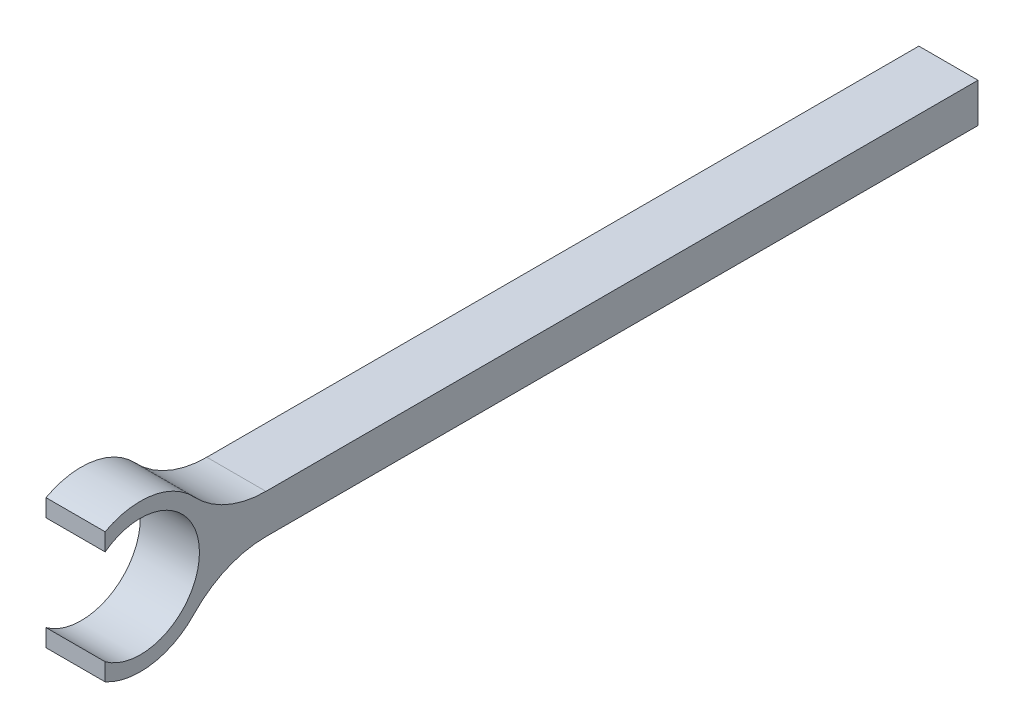
ISO-10303-21;
HEADER;
FILE_DESCRIPTION(('STEP AP214'),'2;1');
FILE_NAME('part.step','',(''),(''),'','','');
FILE_SCHEMA(('AUTOMOTIVE_DESIGN { 1 0 10303 214 1 1 1 1 }'));
ENDSEC;
DATA;
#1=APPLICATION_CONTEXT('core data for automotive mechanical design processes');
#2=APPLICATION_PROTOCOL_DEFINITION('international standard','automotive_design',2000,#1);
#3=PRODUCT_CONTEXT('',#1,'mechanical');
#4=PRODUCT('Part','Part','',(#3));
#5=PRODUCT_RELATED_PRODUCT_CATEGORY('part','',(#4));
#6=PRODUCT_DEFINITION_FORMATION('','',#4);
#7=PRODUCT_DEFINITION_CONTEXT('part definition',#1,'design');
#8=PRODUCT_DEFINITION('design','',#6,#7);
#9=PRODUCT_DEFINITION_SHAPE('','',#8);
#10=(LENGTH_UNIT() NAMED_UNIT(*) SI_UNIT(.MILLI.,.METRE.));
#11=(NAMED_UNIT(*) PLANE_ANGLE_UNIT() SI_UNIT($,.RADIAN.));
#12=(NAMED_UNIT(*) SI_UNIT($,.STERADIAN.) SOLID_ANGLE_UNIT());
#13=UNCERTAINTY_MEASURE_WITH_UNIT(LENGTH_MEASURE(1.E-05),#10,'distance_accuracy_value','');
#14=(GEOMETRIC_REPRESENTATION_CONTEXT(3) GLOBAL_UNCERTAINTY_ASSIGNED_CONTEXT((#13)) GLOBAL_UNIT_ASSIGNED_CONTEXT((#10,
#11,#12)) REPRESENTATION_CONTEXT('',''));
#15=CARTESIAN_POINT('',(0.,0.,0.));
#16=DIRECTION('',(0.,0.,1.));
#17=DIRECTION('',(1.,0.,0.));
#18=AXIS2_PLACEMENT_3D('',#15,#16,#17);
#19=CARTESIAN_POINT('',(6.,0.,0.));
#20=DIRECTION('',(-1.,0.,0.));
#21=DIRECTION('',(0.,0.,1.));
#22=AXIS2_PLACEMENT_3D('',#19,#20,#21);
#23=CYLINDRICAL_SURFACE('',#22,6.);
#24=CARTESIAN_POINT('',(0.,0.,0.));
#25=DIRECTION('',(1.,0.,0.));
#26=DIRECTION('',(0.,0.,-1.));
#27=AXIS2_PLACEMENT_3D('',#24,#25,#26);
#28=CIRCLE('',#27,6.);
#29=CARTESIAN_POINT('',(0.,-4.82343828467986,3.56853514959354));
#30=VERTEX_POINT('',#29);
#31=CARTESIAN_POINT('',(0.,4.82343828467986,3.56853514959354));
#32=VERTEX_POINT('',#31);
#33=EDGE_CURVE('E117',#30,#32,#28,.T.);
#34=ORIENTED_EDGE('',*,*,#33,.F.);
#35=DIRECTION('',(-1.,0.,0.));
#36=VECTOR('',#35,1.);
#37=CARTESIAN_POINT('',(6.,-4.82343828467986,3.56853514959354));
#38=LINE('',#37,#36);
#39=CARTESIAN_POINT('',(6.,-4.82343828467986,3.56853514959354));
#40=VERTEX_POINT('',#39);
#41=EDGE_CURVE('E112',#40,#30,#38,.T.);
#42=ORIENTED_EDGE('',*,*,#41,.F.);
#43=CARTESIAN_POINT('',(6.,0.,0.));
#44=DIRECTION('',(1.,0.,0.));
#45=DIRECTION('',(0.,0.,-1.));
#46=AXIS2_PLACEMENT_3D('',#43,#44,#45);
#47=CIRCLE('',#46,6.);
#48=CARTESIAN_POINT('',(6.,4.82343828467986,3.56853514959354));
#49=VERTEX_POINT('',#48);
#50=EDGE_CURVE('E115',#40,#49,#47,.T.);
#51=ORIENTED_EDGE('',*,*,#50,.T.);
#52=DIRECTION('',(-1.,0.,0.));
#53=VECTOR('',#52,1.);
#54=CARTESIAN_POINT('',(6.,4.82343828467986,3.56853514959354));
#55=LINE('',#54,#53);
#56=EDGE_CURVE('E160',#49,#32,#55,.T.);
#57=ORIENTED_EDGE('',*,*,#56,.T.);
#58=EDGE_LOOP('',(#34,#42,#51,#57));
#59=FACE_BOUND('',#58,.T.);
#60=ADVANCED_FACE('F35',(#59),#23,.F.);
#61=CARTESIAN_POINT('',(6.,0.,3.56853514959354));
#62=DIRECTION('',(0.,0.,-1.));
#63=DIRECTION('',(0.,1.,0.));
#64=AXIS2_PLACEMENT_3D('',#61,#62,#63);
#65=PLANE('',#64);
#66=DIRECTION('',(0.,-1.,0.));
#67=VECTOR('',#66,1.);
#68=CARTESIAN_POINT('',(0.,0.,3.56853514959354));
#69=LINE('',#68,#67);
#70=CARTESIAN_POINT('',(0.,-6.59663223820423,3.56853514959354));
#71=VERTEX_POINT('',#70);
#72=EDGE_CURVE('E139',#30,#71,#69,.T.);
#73=ORIENTED_EDGE('',*,*,#72,.T.);
#74=DIRECTION('',(-1.,0.,0.));
#75=VECTOR('',#74,1.);
#76=CARTESIAN_POINT('',(6.,-6.59663223820423,3.56853514959354));
#77=LINE('',#76,#75);
#78=CARTESIAN_POINT('',(6.,-6.59663223820423,3.56853514959354));
#79=VERTEX_POINT('',#78);
#80=EDGE_CURVE('E121',#79,#71,#77,.T.);
#81=ORIENTED_EDGE('',*,*,#80,.F.);
#82=DIRECTION('',(0.,-1.,0.));
#83=VECTOR('',#82,1.);
#84=CARTESIAN_POINT('',(6.,0.,3.56853514959354));
#85=LINE('',#84,#83);
#86=EDGE_CURVE('E124',#40,#79,#85,.T.);
#87=ORIENTED_EDGE('',*,*,#86,.F.);
#88=ORIENTED_EDGE('',*,*,#41,.T.);
#89=EDGE_LOOP('',(#73,#81,#87,#88));
#90=FACE_BOUND('',#89,.T.);
#91=ADVANCED_FACE('F125',(#90),#65,.F.);
#92=CARTESIAN_POINT('',(6.,0.,0.));
#93=DIRECTION('',(-1.,0.,0.));
#94=DIRECTION('',(0.,0.,1.));
#95=AXIS2_PLACEMENT_3D('',#92,#93,#94);
#96=CYLINDRICAL_SURFACE('',#95,7.5);
#97=CARTESIAN_POINT('',(0.,0.,0.));
#98=DIRECTION('',(1.,0.,0.));
#99=DIRECTION('',(0.,0.,-1.));
#100=AXIS2_PLACEMENT_3D('',#97,#98,#99);
#101=CIRCLE('',#100,7.5);
#102=CARTESIAN_POINT('',(0.,-5.13860338649339,-5.46303535008869));
#103=VERTEX_POINT('',#102);
#104=EDGE_CURVE('E151',#71,#103,#101,.T.);
#105=ORIENTED_EDGE('',*,*,#104,.T.);
#106=DIRECTION('',(-1.,0.,0.));
#107=VECTOR('',#106,1.);
#108=CARTESIAN_POINT('',(6.,-5.13860338649339,-5.46303535008869));
#109=LINE('',#108,#107);
#110=CARTESIAN_POINT('',(6.,-5.13860338649339,-5.46303535008869));
#111=VERTEX_POINT('',#110);
#112=EDGE_CURVE('E50',#103,#111,#109,.F.);
#113=ORIENTED_EDGE('',*,*,#112,.T.);
#114=CARTESIAN_POINT('',(6.,0.,0.));
#115=DIRECTION('',(1.,0.,0.));
#116=DIRECTION('',(0.,0.,-1.));
#117=AXIS2_PLACEMENT_3D('',#114,#115,#116);
#118=CIRCLE('',#117,7.5);
#119=EDGE_CURVE('E128',#79,#111,#118,.T.);
#120=ORIENTED_EDGE('',*,*,#119,.F.);
#121=ORIENTED_EDGE('',*,*,#80,.T.);
#122=EDGE_LOOP('',(#105,#113,#120,#121));
#123=FACE_BOUND('',#122,.T.);
#124=ADVANCED_FACE('F211',(#123),#96,.T.);
#125=CARTESIAN_POINT('',(6.,-1.99007456848459,0.));
#126=DIRECTION('',(0.,1.,0.));
#127=DIRECTION('',(0.,0.,1.));
#128=AXIS2_PLACEMENT_3D('',#125,#126,#127);
#129=PLANE('',#128);
#130=DIRECTION('',(0.,0.,-1.));
#131=VECTOR('',#130,1.);
#132=CARTESIAN_POINT('',(6.,-1.99007456848459,0.));
#133=LINE('',#132,#131);
#134=CARTESIAN_POINT('',(6.,-1.99007456848459,-12.7470824835403));
#135=VERTEX_POINT('',#134);
#136=CARTESIAN_POINT('',(6.,-1.99007456848459,-85.));
#137=VERTEX_POINT('',#136);
#138=EDGE_CURVE('E142',#135,#137,#133,.T.);
#139=ORIENTED_EDGE('',*,*,#138,.F.);
#140=DIRECTION('',(1.,0.,0.));
#141=VECTOR('',#140,1.);
#142=CARTESIAN_POINT('',(0.,-1.99007456848459,-12.7470824835403));
#143=LINE('',#142,#141);
#144=CARTESIAN_POINT('',(0.,-1.99007456848459,-12.7470824835403));
#145=VERTEX_POINT('',#144);
#146=EDGE_CURVE('E176',#135,#145,#143,.F.);
#147=ORIENTED_EDGE('',*,*,#146,.T.);
#148=DIRECTION('',(0.,0.,-1.));
#149=VECTOR('',#148,1.);
#150=CARTESIAN_POINT('',(0.,-1.99007456848459,0.));
#151=LINE('',#150,#149);
#152=CARTESIAN_POINT('',(0.,-1.99007456848459,-85.));
#153=VERTEX_POINT('',#152);
#154=EDGE_CURVE('E153',#145,#153,#151,.T.);
#155=ORIENTED_EDGE('',*,*,#154,.T.);
#156=DIRECTION('',(-1.,0.,0.));
#157=VECTOR('',#156,1.);
#158=CARTESIAN_POINT('',(6.,-1.99007456848459,-85.));
#159=LINE('',#158,#157);
#160=EDGE_CURVE('E168',#137,#153,#159,.T.);
#161=ORIENTED_EDGE('',*,*,#160,.F.);
#162=EDGE_LOOP('',(#139,#147,#155,#161));
#163=FACE_BOUND('',#162,.T.);
#164=ADVANCED_FACE('F207',(#163),#129,.F.);
#165=CARTESIAN_POINT('',(6.,0.,-85.));
#166=DIRECTION('',(0.,0.,1.));
#167=DIRECTION('',(1.,0.,0.));
#168=AXIS2_PLACEMENT_3D('',#165,#166,#167);
#169=PLANE('',#168);
#170=DIRECTION('',(0.,1.,0.));
#171=VECTOR('',#170,1.);
#172=CARTESIAN_POINT('',(0.,0.,-85.));
#173=LINE('',#172,#171);
#174=CARTESIAN_POINT('',(0.,1.99007456848459,-85.));
#175=VERTEX_POINT('',#174);
#176=EDGE_CURVE('E155',#153,#175,#173,.T.);
#177=ORIENTED_EDGE('',*,*,#176,.T.);
#178=DIRECTION('',(-1.,0.,0.));
#179=VECTOR('',#178,1.);
#180=CARTESIAN_POINT('',(6.,1.99007456848459,-85.));
#181=LINE('',#180,#179);
#182=CARTESIAN_POINT('',(6.,1.99007456848459,-85.));
#183=VERTEX_POINT('',#182);
#184=EDGE_CURVE('E165',#183,#175,#181,.T.);
#185=ORIENTED_EDGE('',*,*,#184,.F.);
#186=DIRECTION('',(0.,1.,0.));
#187=VECTOR('',#186,1.);
#188=CARTESIAN_POINT('',(6.,0.,-85.));
#189=LINE('',#188,#187);
#190=EDGE_CURVE('E145',#137,#183,#189,.T.);
#191=ORIENTED_EDGE('',*,*,#190,.F.);
#192=ORIENTED_EDGE('',*,*,#160,.T.);
#193=EDGE_LOOP('',(#177,#185,#191,#192));
#194=FACE_BOUND('',#193,.T.);
#195=ADVANCED_FACE('F203',(#194),#169,.F.);
#196=CARTESIAN_POINT('',(6.,1.99007456848459,0.));
#197=DIRECTION('',(0.,1.,0.));
#198=DIRECTION('',(0.,0.,1.));
#199=AXIS2_PLACEMENT_3D('',#196,#197,#198);
#200=PLANE('',#199);
#201=DIRECTION('',(0.,0.,-1.));
#202=VECTOR('',#201,1.);
#203=CARTESIAN_POINT('',(0.,1.99007456848459,0.));
#204=LINE('',#203,#202);
#205=CARTESIAN_POINT('',(0.,1.99007456848459,-12.7470824835403));
#206=VERTEX_POINT('',#205);
#207=EDGE_CURVE('E158',#206,#175,#204,.T.);
#208=ORIENTED_EDGE('',*,*,#207,.F.);
#209=DIRECTION('',(-1.,0.,0.));
#210=VECTOR('',#209,1.);
#211=CARTESIAN_POINT('',(6.,1.99007456848459,-12.7470824835403));
#212=LINE('',#211,#210);
#213=CARTESIAN_POINT('',(6.,1.99007456848459,-12.7470824835403));
#214=VERTEX_POINT('',#213);
#215=EDGE_CURVE('E174',#206,#214,#212,.F.);
#216=ORIENTED_EDGE('',*,*,#215,.T.);
#217=DIRECTION('',(0.,0.,-1.));
#218=VECTOR('',#217,1.);
#219=CARTESIAN_POINT('',(6.,1.99007456848459,0.));
#220=LINE('',#219,#218);
#221=EDGE_CURVE('E148',#214,#183,#220,.T.);
#222=ORIENTED_EDGE('',*,*,#221,.T.);
#223=ORIENTED_EDGE('',*,*,#184,.T.);
#224=EDGE_LOOP('',(#208,#216,#222,#223));
#225=FACE_BOUND('',#224,.T.);
#226=ADVANCED_FACE('F199',(#225),#200,.T.);
#227=CARTESIAN_POINT('',(6.,5.13860338649339,-5.46303535008869));
#228=VERTEX_POINT('',#227);
#229=CARTESIAN_POINT('',(6.,6.59663223820423,3.56853514959354));
#230=VERTEX_POINT('',#229);
#231=EDGE_CURVE('E143',#228,#230,#118,.T.);
#232=ORIENTED_EDGE('',*,*,#231,.F.);
#233=DIRECTION('',(-1.,0.,0.));
#234=VECTOR('',#233,1.);
#235=CARTESIAN_POINT('',(6.,5.13860338649339,-5.46303535008869));
#236=LINE('',#235,#234);
#237=CARTESIAN_POINT('',(0.,5.13860338649339,-5.46303535008869));
#238=VERTEX_POINT('',#237);
#239=EDGE_CURVE('E120',#228,#238,#236,.T.);
#240=ORIENTED_EDGE('',*,*,#239,.T.);
#241=CARTESIAN_POINT('',(0.,6.59663223820423,3.56853514959354));
#242=VERTEX_POINT('',#241);
#243=EDGE_CURVE('E137',#238,#242,#101,.T.);
#244=ORIENTED_EDGE('',*,*,#243,.T.);
#245=DIRECTION('',(-1.,0.,0.));
#246=VECTOR('',#245,1.);
#247=CARTESIAN_POINT('',(6.,6.59663223820423,3.56853514959354));
#248=LINE('',#247,#246);
#249=EDGE_CURVE('E162',#230,#242,#248,.T.);
#250=ORIENTED_EDGE('',*,*,#249,.F.);
#251=EDGE_LOOP('',(#232,#240,#244,#250));
#252=FACE_BOUND('',#251,.T.);
#253=ADVANCED_FACE('F191',(#252),#96,.T.);
#254=EDGE_CURVE('E134',#242,#32,#69,.T.);
#255=ORIENTED_EDGE('',*,*,#254,.T.);
#256=ORIENTED_EDGE('',*,*,#56,.F.);
#257=EDGE_CURVE('E130',#230,#49,#85,.T.);
#258=ORIENTED_EDGE('',*,*,#257,.F.);
#259=ORIENTED_EDGE('',*,*,#249,.T.);
#260=EDGE_LOOP('',(#255,#256,#258,#259));
#261=FACE_BOUND('',#260,.T.);
#262=ADVANCED_FACE('F213',(#261),#65,.F.);
#263=CARTESIAN_POINT('',(6.,0.,0.));
#264=DIRECTION('',(1.,0.,0.));
#265=DIRECTION('',(0.,0.,-1.));
#266=AXIS2_PLACEMENT_3D('',#263,#264,#265);
#267=PLANE('',#266);
#268=ORIENTED_EDGE('',*,*,#50,.F.);
#269=ORIENTED_EDGE('',*,*,#86,.T.);
#270=ORIENTED_EDGE('',*,*,#119,.T.);
#271=CARTESIAN_POINT('',(6.,-11.9900745684846,-12.7470824835403));
#272=DIRECTION('',(1.,0.,0.));
#273=DIRECTION('',(0.,0.,-1.));
#274=AXIS2_PLACEMENT_3D('',#271,#272,#273);
#275=CIRCLE('',#274,10.);
#276=EDGE_CURVE('E11',#111,#135,#275,.F.);
#277=ORIENTED_EDGE('',*,*,#276,.T.);
#278=ORIENTED_EDGE('',*,*,#138,.T.);
#279=ORIENTED_EDGE('',*,*,#190,.T.);
#280=ORIENTED_EDGE('',*,*,#221,.F.);
#281=CARTESIAN_POINT('',(6.,11.9900745684846,-12.7470824835403));
#282=DIRECTION('',(1.,0.,0.));
#283=DIRECTION('',(0.,0.,-1.));
#284=AXIS2_PLACEMENT_3D('',#281,#282,#283);
#285=CIRCLE('',#284,10.);
#286=EDGE_CURVE('E182',#214,#228,#285,.F.);
#287=ORIENTED_EDGE('',*,*,#286,.T.);
#288=ORIENTED_EDGE('',*,*,#231,.T.);
#289=ORIENTED_EDGE('',*,*,#257,.T.);
#290=EDGE_LOOP('',(#268,#269,#270,#277,#278,#279,#280,#287,#288,#289));
#291=FACE_BOUND('',#290,.T.);
#292=ADVANCED_FACE('F131',(#291),#267,.T.);
#293=CARTESIAN_POINT('',(0.,0.,0.));
#294=DIRECTION('',(1.,0.,0.));
#295=DIRECTION('',(0.,0.,-1.));
#296=AXIS2_PLACEMENT_3D('',#293,#294,#295);
#297=PLANE('',#296);
#298=ORIENTED_EDGE('',*,*,#33,.T.);
#299=ORIENTED_EDGE('',*,*,#254,.F.);
#300=ORIENTED_EDGE('',*,*,#243,.F.);
#301=CARTESIAN_POINT('',(0.,11.9900745684846,-12.7470824835403));
#302=DIRECTION('',(1.,0.,0.));
#303=DIRECTION('',(0.,0.,-1.));
#304=AXIS2_PLACEMENT_3D('',#301,#302,#303);
#305=CIRCLE('',#304,10.);
#306=EDGE_CURVE('E180',#238,#206,#305,.T.);
#307=ORIENTED_EDGE('',*,*,#306,.T.);
#308=ORIENTED_EDGE('',*,*,#207,.T.);
#309=ORIENTED_EDGE('',*,*,#176,.F.);
#310=ORIENTED_EDGE('',*,*,#154,.F.);
#311=CARTESIAN_POINT('',(0.,-11.9900745684846,-12.7470824835403));
#312=DIRECTION('',(1.,0.,0.));
#313=DIRECTION('',(0.,0.,-1.));
#314=AXIS2_PLACEMENT_3D('',#311,#312,#313);
#315=CIRCLE('',#314,10.);
#316=EDGE_CURVE('E43',#145,#103,#315,.T.);
#317=ORIENTED_EDGE('',*,*,#316,.T.);
#318=ORIENTED_EDGE('',*,*,#104,.F.);
#319=ORIENTED_EDGE('',*,*,#72,.F.);
#320=EDGE_LOOP('',(#298,#299,#300,#307,#308,#309,#310,#317,#318,#319));
#321=FACE_BOUND('',#320,.T.);
#322=ADVANCED_FACE('F195',(#321),#297,.F.);
#323=CARTESIAN_POINT('',(6.,11.9900745684846,-12.7470824835403));
#324=DIRECTION('',(-1.,0.,0.));
#325=DIRECTION('',(0.,0.,1.));
#326=AXIS2_PLACEMENT_3D('',#323,#324,#325);
#327=CYLINDRICAL_SURFACE('',#326,10.);
#328=ORIENTED_EDGE('',*,*,#286,.F.);
#329=ORIENTED_EDGE('',*,*,#215,.F.);
#330=ORIENTED_EDGE('',*,*,#306,.F.);
#331=ORIENTED_EDGE('',*,*,#239,.F.);
#332=EDGE_LOOP('',(#328,#329,#330,#331));
#333=FACE_BOUND('',#332,.T.);
#334=ADVANCED_FACE('F193',(#333),#327,.F.);
#335=CARTESIAN_POINT('',(6.,-11.9900745684846,-12.7470824835403));
#336=DIRECTION('',(-1.,0.,0.));
#337=DIRECTION('',(0.,0.,1.));
#338=AXIS2_PLACEMENT_3D('',#335,#336,#337);
#339=CYLINDRICAL_SURFACE('',#338,10.);
#340=ORIENTED_EDGE('',*,*,#276,.F.);
#341=ORIENTED_EDGE('',*,*,#112,.F.);
#342=ORIENTED_EDGE('',*,*,#316,.F.);
#343=ORIENTED_EDGE('',*,*,#146,.F.);
#344=EDGE_LOOP('',(#340,#341,#342,#343));
#345=FACE_BOUND('',#344,.T.);
#346=ADVANCED_FACE('F37',(#345),#339,.F.);
#347=CLOSED_SHELL('',(#60,#91,#124,#164,#195,#226,#253,#262,#292,#322,#334,#346));
#348=MANIFOLD_SOLID_BREP('B2',#347);
#349=ADVANCED_BREP_SHAPE_REPRESENTATION('',(#18,#348),#14);
#350=SHAPE_DEFINITION_REPRESENTATION(#9,#349);
ENDSEC;
END-ISO-10303-21;
